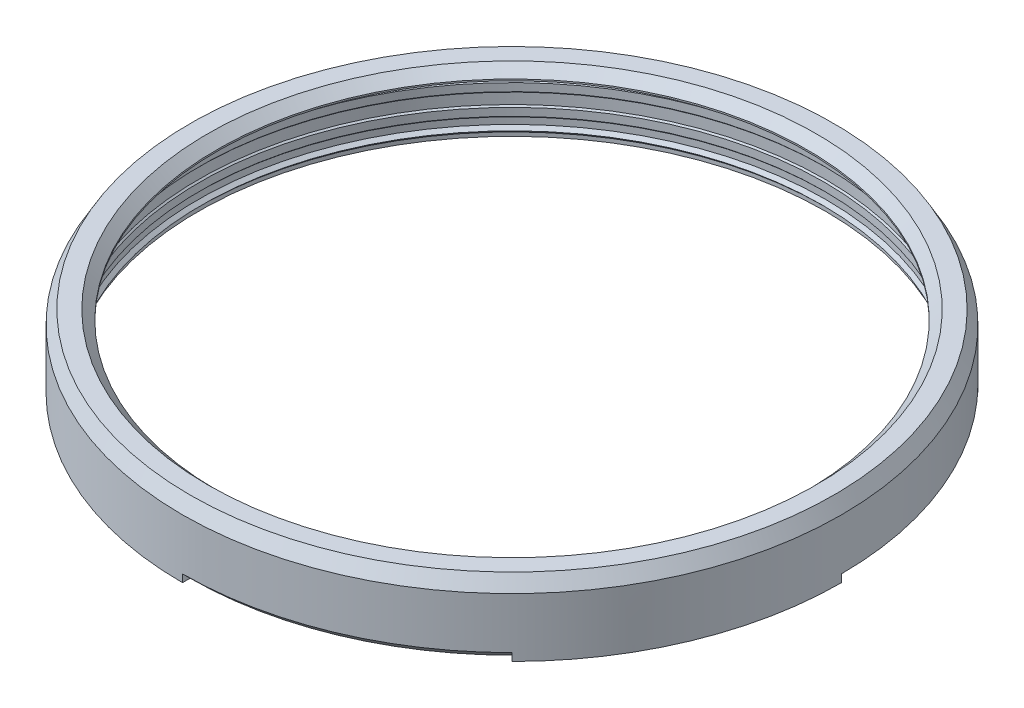
ISO-10303-21;
HEADER;
FILE_DESCRIPTION(('STEP AP214'),'2;1');
FILE_NAME('part.step','',(''),(''),'','','');
FILE_SCHEMA(('AUTOMOTIVE_DESIGN { 1 0 10303 214 1 1 1 1 }'));
ENDSEC;
DATA;
#1=APPLICATION_CONTEXT('core data for automotive mechanical design processes');
#2=APPLICATION_PROTOCOL_DEFINITION('international standard','automotive_design',2000,#1);
#3=PRODUCT_CONTEXT('',#1,'mechanical');
#4=PRODUCT('Part','Part','',(#3));
#5=PRODUCT_RELATED_PRODUCT_CATEGORY('part','',(#4));
#6=PRODUCT_DEFINITION_FORMATION('','',#4);
#7=PRODUCT_DEFINITION_CONTEXT('part definition',#1,'design');
#8=PRODUCT_DEFINITION('design','',#6,#7);
#9=PRODUCT_DEFINITION_SHAPE('','',#8);
#10=(LENGTH_UNIT() NAMED_UNIT(*) SI_UNIT(.MILLI.,.METRE.));
#11=(NAMED_UNIT(*) PLANE_ANGLE_UNIT() SI_UNIT($,.RADIAN.));
#12=(NAMED_UNIT(*) SI_UNIT($,.STERADIAN.) SOLID_ANGLE_UNIT());
#13=UNCERTAINTY_MEASURE_WITH_UNIT(LENGTH_MEASURE(1.E-05),#10,'distance_accuracy_value','');
#14=(GEOMETRIC_REPRESENTATION_CONTEXT(3) GLOBAL_UNCERTAINTY_ASSIGNED_CONTEXT((#13)) GLOBAL_UNIT_ASSIGNED_CONTEXT((#10,
#11,#12)) REPRESENTATION_CONTEXT('',''));
#15=CARTESIAN_POINT('',(0.,0.,0.));
#16=DIRECTION('',(0.,0.,1.));
#17=DIRECTION('',(1.,0.,0.));
#18=AXIS2_PLACEMENT_3D('',#15,#16,#17);
#19=CARTESIAN_POINT('',(0.,-1.39999999999983,0.));
#20=DIRECTION('',(0.,-1.,0.));
#21=DIRECTION('',(0.,0.,-1.));
#22=AXIS2_PLACEMENT_3D('',#19,#20,#21);
#23=TOROIDAL_SURFACE('',#22,39.5300000000001,1.39999999999978);
#24=CARTESIAN_POINT('',(0.,-1.39999999999983,0.));
#25=DIRECTION('',(0.,-1.,0.));
#26=DIRECTION('',(0.,0.,-1.));
#27=AXIS2_PLACEMENT_3D('',#24,#25,#26);
#28=CIRCLE('',#27,40.9299999999999);
#29=CARTESIAN_POINT('',(0.,-1.39999999999983,-40.9299999999999));
#30=VERTEX_POINT('',#29);
#31=EDGE_CURVE('E260',#30,#30,#28,.T.);
#32=ORIENTED_EDGE('',*,*,#31,.T.);
#33=EDGE_LOOP('',(#32));
#34=FACE_BOUND('',#33,.T.);
#35=CARTESIAN_POINT('',(0.,-0.0225022686044408,0.));
#36=DIRECTION('',(0.,-1.,0.));
#37=DIRECTION('',(0.,0.,-1.));
#38=AXIS2_PLACEMENT_3D('',#35,#36,#37);
#39=CIRCLE('',#38,39.78);
#40=CARTESIAN_POINT('',(0.,-0.0225022686044408,-39.78));
#41=VERTEX_POINT('',#40);
#42=EDGE_CURVE('E43',#41,#41,#39,.F.);
#43=ORIENTED_EDGE('',*,*,#42,.T.);
#44=EDGE_LOOP('',(#43));
#45=FACE_BOUND('',#44,.T.);
#46=ADVANCED_FACE('F38',(#34,#45),#23,.F.);
#47=CARTESIAN_POINT('',(0.,0.,0.));
#48=DIRECTION('',(0.,1.,0.));
#49=DIRECTION('',(0.,0.,1.));
#50=AXIS2_PLACEMENT_3D('',#47,#48,#49);
#51=PLANE('',#50);
#52=CARTESIAN_POINT('',(0.,0.,0.));
#53=DIRECTION('',(0.,1.,0.));
#54=DIRECTION('',(0.,0.,1.));
#55=AXIS2_PLACEMENT_3D('',#52,#53,#54);
#56=CIRCLE('',#55,38.5);
#57=CARTESIAN_POINT('',(0.,0.,38.5));
#58=VERTEX_POINT('',#57);
#59=EDGE_CURVE('E218',#58,#58,#56,.T.);
#60=ORIENTED_EDGE('',*,*,#59,.T.);
#61=EDGE_LOOP('',(#60));
#62=FACE_BOUND('',#61,.T.);
#63=CARTESIAN_POINT('',(0.,0.,0.));
#64=DIRECTION('',(0.,-1.,0.));
#65=DIRECTION('',(0.,0.,-1.));
#66=AXIS2_PLACEMENT_3D('',#63,#64,#65);
#67=CIRCLE('',#66,39.32);
#68=CARTESIAN_POINT('',(0.,0.,-39.32));
#69=VERTEX_POINT('',#68);
#70=EDGE_CURVE('E571',#69,#69,#67,.T.);
#71=ORIENTED_EDGE('',*,*,#70,.T.);
#72=EDGE_LOOP('',(#71));
#73=FACE_BOUND('',#72,.T.);
#74=ADVANCED_FACE('F291',(#62,#73),#51,.F.);
#75=CARTESIAN_POINT('',(0.,2.,0.));
#76=DIRECTION('',(0.,-1.,0.));
#77=DIRECTION('',(0.,0.,-1.));
#78=AXIS2_PLACEMENT_3D('',#75,#76,#77);
#79=CYLINDRICAL_SURFACE('',#78,43.);
#80=CARTESIAN_POINT('',(0.,-0.332000000000025,0.));
#81=DIRECTION('',(0.,1.,0.));
#82=DIRECTION('',(0.,0.,1.));
#83=AXIS2_PLACEMENT_3D('',#80,#81,#82);
#84=CIRCLE('',#83,43.);
#85=CARTESIAN_POINT('',(0.,-0.332000000000025,43.));
#86=VERTEX_POINT('',#85);
#87=EDGE_CURVE('E11',#86,#86,#84,.F.);
#88=ORIENTED_EDGE('',*,*,#87,.T.);
#89=EDGE_LOOP('',(#88));
#90=FACE_BOUND('',#89,.T.);
#91=DIRECTION('',(0.,1.,0.));
#92=VECTOR('',#91,1.);
#93=CARTESIAN_POINT('',(-30.4055915910217,-8.,-30.4055915910214));
#94=LINE('',#93,#92);
#95=CARTESIAN_POINT('',(-30.4055915910217,-8.,-30.4055915910214));
#96=VERTEX_POINT('',#95);
#97=CARTESIAN_POINT('',(-30.4055915910217,-7.,-30.4055915910214));
#98=VERTEX_POINT('',#97);
#99=EDGE_CURVE('E148',#96,#98,#94,.T.);
#100=ORIENTED_EDGE('',*,*,#99,.F.);
#101=CARTESIAN_POINT('',(0.,-8.,0.));
#102=DIRECTION('',(0.,-1.,0.));
#103=DIRECTION('',(0.,0.,-1.));
#104=AXIS2_PLACEMENT_3D('',#101,#102,#103);
#105=CIRCLE('',#104,42.9999999999998);
#106=CARTESIAN_POINT('',(-42.9999999999998,-8.,0.));
#107=VERTEX_POINT('',#106);
#108=EDGE_CURVE('E322',#107,#96,#105,.T.);
#109=ORIENTED_EDGE('',*,*,#108,.F.);
#110=DIRECTION('',(0.,1.,0.));
#111=VECTOR('',#110,1.);
#112=CARTESIAN_POINT('',(-43.,-8.,0.));
#113=LINE('',#112,#111);
#114=CARTESIAN_POINT('',(-43.,-7.,0.));
#115=VERTEX_POINT('',#114);
#116=EDGE_CURVE('E63',#107,#115,#113,.T.);
#117=ORIENTED_EDGE('',*,*,#116,.T.);
#118=CARTESIAN_POINT('',(0.,-7.,0.));
#119=DIRECTION('',(0.,-1.,0.));
#120=DIRECTION('',(0.,0.,1.));
#121=AXIS2_PLACEMENT_3D('',#118,#119,#120);
#122=CIRCLE('',#121,43.);
#123=CARTESIAN_POINT('',(-30.4055915910215,-7.,30.4055915910216));
#124=VERTEX_POINT('',#123);
#125=EDGE_CURVE('E166',#124,#115,#122,.T.);
#126=ORIENTED_EDGE('',*,*,#125,.F.);
#127=DIRECTION('',(0.,1.,0.));
#128=VECTOR('',#127,1.);
#129=CARTESIAN_POINT('',(-30.4055915910215,-8.,30.4055915910216));
#130=LINE('',#129,#128);
#131=CARTESIAN_POINT('',(-30.4055915910215,-8.,30.4055915910216));
#132=VERTEX_POINT('',#131);
#133=EDGE_CURVE('E134',#132,#124,#130,.T.);
#134=ORIENTED_EDGE('',*,*,#133,.F.);
#135=CARTESIAN_POINT('',(4.5009785739761E-13,-8.,42.9999999999998));
#136=VERTEX_POINT('',#135);
#137=EDGE_CURVE('E223',#136,#132,#105,.T.);
#138=ORIENTED_EDGE('',*,*,#137,.F.);
#139=DIRECTION('',(0.,1.,0.));
#140=VECTOR('',#139,1.);
#141=CARTESIAN_POINT('',(4.50401092710764E-13,-8.,43.));
#142=LINE('',#141,#140);
#143=CARTESIAN_POINT('',(4.50401092710764E-13,-7.,43.));
#144=VERTEX_POINT('',#143);
#145=EDGE_CURVE('E182',#136,#144,#142,.T.);
#146=ORIENTED_EDGE('',*,*,#145,.T.);
#147=CARTESIAN_POINT('',(0.,-7.,0.));
#148=DIRECTION('',(0.,-1.,0.));
#149=DIRECTION('',(1.,0.,0.));
#150=AXIS2_PLACEMENT_3D('',#147,#148,#149);
#151=CIRCLE('',#150,43.);
#152=CARTESIAN_POINT('',(30.4055915910219,-7.,30.4055915910212));
#153=VERTEX_POINT('',#152);
#154=EDGE_CURVE('E187',#153,#144,#151,.T.);
#155=ORIENTED_EDGE('',*,*,#154,.F.);
#156=DIRECTION('',(0.,1.,0.));
#157=VECTOR('',#156,1.);
#158=CARTESIAN_POINT('',(30.4055915910219,-8.,30.4055915910212));
#159=LINE('',#158,#157);
#160=CARTESIAN_POINT('',(30.4055915910219,-8.,30.4055915910212));
#161=VERTEX_POINT('',#160);
#162=EDGE_CURVE('E160',#161,#153,#159,.T.);
#163=ORIENTED_EDGE('',*,*,#162,.F.);
#164=CARTESIAN_POINT('',(42.9999999999998,-8.,0.));
#165=VERTEX_POINT('',#164);
#166=EDGE_CURVE('E219',#165,#161,#105,.T.);
#167=ORIENTED_EDGE('',*,*,#166,.F.);
#168=DIRECTION('',(0.,1.,0.));
#169=VECTOR('',#168,1.);
#170=CARTESIAN_POINT('',(43.,-8.,0.));
#171=LINE('',#170,#169);
#172=CARTESIAN_POINT('',(43.,-7.,0.));
#173=VERTEX_POINT('',#172);
#174=EDGE_CURVE('E199',#165,#173,#171,.T.);
#175=ORIENTED_EDGE('',*,*,#174,.T.);
#176=CARTESIAN_POINT('',(0.,-7.,0.));
#177=DIRECTION('',(0.,-1.,0.));
#178=DIRECTION('',(0.,0.,-1.));
#179=AXIS2_PLACEMENT_3D('',#176,#177,#178);
#180=CIRCLE('',#179,43.);
#181=CARTESIAN_POINT('',(30.4055915910215,-7.,-30.4055915910216));
#182=VERTEX_POINT('',#181);
#183=EDGE_CURVE('E216',#182,#173,#180,.T.);
#184=ORIENTED_EDGE('',*,*,#183,.F.);
#185=DIRECTION('',(0.,1.,0.));
#186=VECTOR('',#185,1.);
#187=CARTESIAN_POINT('',(30.4055915910215,-8.,-30.4055915910216));
#188=LINE('',#187,#186);
#189=CARTESIAN_POINT('',(30.4055915910215,-8.,-30.4055915910216));
#190=VERTEX_POINT('',#189);
#191=EDGE_CURVE('E208',#190,#182,#188,.T.);
#192=ORIENTED_EDGE('',*,*,#191,.F.);
#193=CARTESIAN_POINT('',(-1.50234776007971E-13,-8.,-42.9999999999998));
#194=VERTEX_POINT('',#193);
#195=EDGE_CURVE('E224',#194,#190,#105,.T.);
#196=ORIENTED_EDGE('',*,*,#195,.F.);
#197=DIRECTION('',(0.,1.,0.));
#198=VECTOR('',#197,1.);
#199=CARTESIAN_POINT('',(-1.50133697570255E-13,-8.,-43.));
#200=LINE('',#199,#198);
#201=CARTESIAN_POINT('',(-1.50133697570255E-13,-7.,-43.));
#202=VERTEX_POINT('',#201);
#203=EDGE_CURVE('E55',#194,#202,#200,.T.);
#204=ORIENTED_EDGE('',*,*,#203,.T.);
#205=CARTESIAN_POINT('',(0.,-7.,0.));
#206=DIRECTION('',(0.,-1.,0.));
#207=DIRECTION('',(-1.,0.,0.));
#208=AXIS2_PLACEMENT_3D('',#205,#206,#207);
#209=CIRCLE('',#208,43.);
#210=EDGE_CURVE('E142',#98,#202,#209,.T.);
#211=ORIENTED_EDGE('',*,*,#210,.F.);
#212=EDGE_LOOP('',(#100,#109,#117,#126,#134,#138,#146,#155,#163,#167,#175,#184,#192,#196,#204,#211));
#213=FACE_BOUND('',#212,.T.);
#214=ADVANCED_FACE('F299',(#90,#213),#79,.T.);
#215=CARTESIAN_POINT('',(20.5178266911639,-8.,37.7891358444639));
#216=DIRECTION('',(0.,-1.,0.));
#217=DIRECTION('',(0.,0.,-1.));
#218=AXIS2_PLACEMENT_3D('',#215,#216,#217);
#219=PLANE('',#218);
#220=CARTESIAN_POINT('',(0.,-8.00000000000001,0.));
#221=DIRECTION('',(0.,-1.,0.));
#222=DIRECTION('',(0.,0.,-1.));
#223=AXIS2_PLACEMENT_3D('',#220,#221,#222);
#224=CIRCLE('',#223,40.9299999999999);
#225=CARTESIAN_POINT('',(0.,-8.00000000000001,-40.9299999999999));
#226=VERTEX_POINT('',#225);
#227=EDGE_CURVE('E222',#226,#226,#224,.T.);
#228=ORIENTED_EDGE('',*,*,#227,.F.);
#229=EDGE_LOOP('',(#228));
#230=FACE_BOUND('',#229,.T.);
#231=ORIENTED_EDGE('',*,*,#108,.T.);
#232=DIRECTION('',(-0.707106781186551,0.,-0.707106781186544));
#233=VECTOR('',#232,1.);
#234=CARTESIAN_POINT('',(-29.6984848098352,-8.00000000000001,-29.6984848098348));
#235=LINE('',#234,#233);
#236=CARTESIAN_POINT('',(-29.6984848098352,-8.00000000000001,-29.6984848098348));
#237=VERTEX_POINT('',#236);
#238=EDGE_CURVE('E146',#237,#96,#235,.T.);
#239=ORIENTED_EDGE('',*,*,#238,.F.);
#240=CARTESIAN_POINT('',(0.,-8.00000000000001,0.));
#241=DIRECTION('',(0.,-1.,0.));
#242=DIRECTION('',(-1.,0.,0.));
#243=AXIS2_PLACEMENT_3D('',#240,#241,#242);
#244=CIRCLE('',#243,42.);
#245=CARTESIAN_POINT('',(-1.46642216231412E-13,-8.00000000000001,-42.));
#246=VERTEX_POINT('',#245);
#247=EDGE_CURVE('E139',#237,#246,#244,.T.);
#248=ORIENTED_EDGE('',*,*,#247,.T.);
#249=DIRECTION('',(0.,0.,-1.));
#250=VECTOR('',#249,1.);
#251=CARTESIAN_POINT('',(-1.46642216231412E-13,-8.00000000000001,-42.));
#252=LINE('',#251,#250);
#253=EDGE_CURVE('E126',#246,#194,#252,.T.);
#254=ORIENTED_EDGE('',*,*,#253,.T.);
#255=ORIENTED_EDGE('',*,*,#195,.T.);
#256=DIRECTION('',(0.707106781186546,0.,-0.707106781186549));
#257=VECTOR('',#256,1.);
#258=CARTESIAN_POINT('',(29.6984848098349,-8.00000000000001,-29.698484809835));
#259=LINE('',#258,#257);
#260=CARTESIAN_POINT('',(29.6984848098349,-8.00000000000001,-29.698484809835));
#261=VERTEX_POINT('',#260);
#262=EDGE_CURVE('E205',#261,#190,#259,.T.);
#263=ORIENTED_EDGE('',*,*,#262,.F.);
#264=CARTESIAN_POINT('',(0.,-8.00000000000001,0.));
#265=DIRECTION('',(0.,-1.,0.));
#266=DIRECTION('',(0.,0.,-1.));
#267=AXIS2_PLACEMENT_3D('',#264,#265,#266);
#268=CIRCLE('',#267,42.);
#269=CARTESIAN_POINT('',(42.,-8.00000000000001,0.));
#270=VERTEX_POINT('',#269);
#271=EDGE_CURVE('E213',#261,#270,#268,.T.);
#272=ORIENTED_EDGE('',*,*,#271,.T.);
#273=DIRECTION('',(1.,0.,0.));
#274=VECTOR('',#273,1.);
#275=CARTESIAN_POINT('',(42.,-8.00000000000001,0.));
#276=LINE('',#275,#274);
#277=EDGE_CURVE('E156',#270,#165,#276,.T.);
#278=ORIENTED_EDGE('',*,*,#277,.T.);
#279=ORIENTED_EDGE('',*,*,#166,.T.);
#280=DIRECTION('',(0.707106781186556,0.,0.707106781186539));
#281=VECTOR('',#280,1.);
#282=CARTESIAN_POINT('',(29.6984848098354,-8.00000000000001,29.6984848098346));
#283=LINE('',#282,#281);
#284=CARTESIAN_POINT('',(29.6984848098354,-8.00000000000001,29.6984848098346));
#285=VERTEX_POINT('',#284);
#286=EDGE_CURVE('E193',#285,#161,#283,.T.);
#287=ORIENTED_EDGE('',*,*,#286,.F.);
#288=CARTESIAN_POINT('',(0.,-8.00000000000001,0.));
#289=DIRECTION('',(0.,-1.,0.));
#290=DIRECTION('',(1.,0.,0.));
#291=AXIS2_PLACEMENT_3D('',#288,#289,#290);
#292=CIRCLE('',#291,42.);
#293=CARTESIAN_POINT('',(4.39926648694235E-13,-8.00000000000001,42.));
#294=VERTEX_POINT('',#293);
#295=EDGE_CURVE('E190',#285,#294,#292,.T.);
#296=ORIENTED_EDGE('',*,*,#295,.T.);
#297=DIRECTION('',(0.,0.,1.));
#298=VECTOR('',#297,1.);
#299=CARTESIAN_POINT('',(4.39926648694235E-13,-8.00000000000001,42.));
#300=LINE('',#299,#298);
#301=EDGE_CURVE('E176',#294,#136,#300,.T.);
#302=ORIENTED_EDGE('',*,*,#301,.T.);
#303=ORIENTED_EDGE('',*,*,#137,.T.);
#304=DIRECTION('',(-0.707106781186546,0.,0.707106781186549));
#305=VECTOR('',#304,1.);
#306=CARTESIAN_POINT('',(-29.6984848098349,-8.00000000000001,29.698484809835));
#307=LINE('',#306,#305);
#308=CARTESIAN_POINT('',(-29.6984848098349,-8.00000000000001,29.698484809835));
#309=VERTEX_POINT('',#308);
#310=EDGE_CURVE('E172',#309,#132,#307,.T.);
#311=ORIENTED_EDGE('',*,*,#310,.F.);
#312=CARTESIAN_POINT('',(0.,-8.00000000000001,0.));
#313=DIRECTION('',(0.,-1.,0.));
#314=DIRECTION('',(0.,0.,1.));
#315=AXIS2_PLACEMENT_3D('',#312,#313,#314);
#316=CIRCLE('',#315,42.);
#317=CARTESIAN_POINT('',(-42.,-8.00000000000001,0.));
#318=VERTEX_POINT('',#317);
#319=EDGE_CURVE('E169',#309,#318,#316,.T.);
#320=ORIENTED_EDGE('',*,*,#319,.T.);
#321=DIRECTION('',(-1.,0.,0.));
#322=VECTOR('',#321,1.);
#323=CARTESIAN_POINT('',(-42.,-8.00000000000001,0.));
#324=LINE('',#323,#322);
#325=EDGE_CURVE('E157',#318,#107,#324,.T.);
#326=ORIENTED_EDGE('',*,*,#325,.T.);
#327=EDGE_LOOP('',(#231,#239,#248,#254,#255,#263,#272,#278,#279,#287,#296,#302,#303,#311,#320,#326));
#328=FACE_BOUND('',#327,.T.);
#329=ADVANCED_FACE('F145',(#230,#328),#219,.T.);
#330=CARTESIAN_POINT('',(0.,-8.00000000000001,0.));
#331=DIRECTION('',(0.,1.,0.));
#332=DIRECTION('',(0.,0.,1.));
#333=AXIS2_PLACEMENT_3D('',#330,#331,#332);
#334=CYLINDRICAL_SURFACE('',#333,38.5);
#335=CARTESIAN_POINT('',(0.,0.200000000000001,0.));
#336=DIRECTION('',(0.,1.,0.));
#337=DIRECTION('',(0.,0.,1.));
#338=AXIS2_PLACEMENT_3D('',#335,#336,#337);
#339=CIRCLE('',#338,38.5);
#340=CARTESIAN_POINT('',(0.,0.200000000000001,38.5));
#341=VERTEX_POINT('',#340);
#342=EDGE_CURVE('E268',#341,#341,#339,.T.);
#343=ORIENTED_EDGE('',*,*,#342,.T.);
#344=EDGE_LOOP('',(#343));
#345=FACE_BOUND('',#344,.T.);
#346=ORIENTED_EDGE('',*,*,#59,.F.);
#347=EDGE_LOOP('',(#346));
#348=FACE_BOUND('',#347,.T.);
#349=ADVANCED_FACE('F316',(#345,#348),#334,.F.);
#350=CARTESIAN_POINT('',(0.,0.,0.));
#351=DIRECTION('',(0.,-1.,0.));
#352=DIRECTION('',(0.,0.,-1.));
#353=AXIS2_PLACEMENT_3D('',#350,#351,#352);
#354=CYLINDRICAL_SURFACE('',#353,40.9299999999999);
#355=CARTESIAN_POINT('',(0.,-1.59999999999961,0.));
#356=DIRECTION('',(0.,-1.,0.));
#357=DIRECTION('',(0.,0.,-1.));
#358=AXIS2_PLACEMENT_3D('',#355,#356,#357);
#359=CIRCLE('',#358,40.9299999999999);
#360=CARTESIAN_POINT('',(0.,-1.59999999999961,-40.9299999999999));
#361=VERTEX_POINT('',#360);
#362=EDGE_CURVE('E257',#361,#361,#359,.T.);
#363=ORIENTED_EDGE('',*,*,#362,.T.);
#364=EDGE_LOOP('',(#363));
#365=FACE_BOUND('',#364,.T.);
#366=ORIENTED_EDGE('',*,*,#31,.F.);
#367=EDGE_LOOP('',(#366));
#368=FACE_BOUND('',#367,.T.);
#369=ADVANCED_FACE('F304',(#365,#368),#354,.F.);
#370=CARTESIAN_POINT('',(0.,-1.59999999999961,0.));
#371=DIRECTION('',(0.,1.,0.));
#372=DIRECTION('',(0.,0.,1.));
#373=AXIS2_PLACEMENT_3D('',#370,#371,#372);
#374=CONICAL_SURFACE('',#373,40.9299999999999,0.785398163397453);
#375=CARTESIAN_POINT('',(0.,-1.78999999999966,0.));
#376=DIRECTION('',(0.,-1.,0.));
#377=DIRECTION('',(0.,0.,-1.));
#378=AXIS2_PLACEMENT_3D('',#375,#376,#377);
#379=CIRCLE('',#378,40.7399999999998);
#380=CARTESIAN_POINT('',(0.,-1.78999999999966,-40.7399999999998));
#381=VERTEX_POINT('',#380);
#382=EDGE_CURVE('E254',#381,#381,#379,.T.);
#383=ORIENTED_EDGE('',*,*,#382,.T.);
#384=EDGE_LOOP('',(#383));
#385=FACE_BOUND('',#384,.T.);
#386=ORIENTED_EDGE('',*,*,#362,.F.);
#387=EDGE_LOOP('',(#386));
#388=FACE_BOUND('',#387,.T.);
#389=ADVANCED_FACE('F420',(#385,#388),#374,.F.);
#390=CARTESIAN_POINT('',(0.,0.,0.));
#391=DIRECTION('',(0.,-1.,0.));
#392=DIRECTION('',(0.,0.,-1.));
#393=AXIS2_PLACEMENT_3D('',#390,#391,#392);
#394=CYLINDRICAL_SURFACE('',#393,40.7399999999998);
#395=CARTESIAN_POINT('',(0.,-2.80999999999967,0.));
#396=DIRECTION('',(0.,-1.,0.));
#397=DIRECTION('',(0.,0.,-1.));
#398=AXIS2_PLACEMENT_3D('',#395,#396,#397);
#399=CIRCLE('',#398,40.7399999999998);
#400=CARTESIAN_POINT('',(0.,-2.80999999999967,-40.7399999999998));
#401=VERTEX_POINT('',#400);
#402=EDGE_CURVE('E251',#401,#401,#399,.T.);
#403=ORIENTED_EDGE('',*,*,#402,.T.);
#404=EDGE_LOOP('',(#403));
#405=FACE_BOUND('',#404,.T.);
#406=ORIENTED_EDGE('',*,*,#382,.F.);
#407=EDGE_LOOP('',(#406));
#408=FACE_BOUND('',#407,.T.);
#409=ADVANCED_FACE('F417',(#405,#408),#394,.F.);
#410=CARTESIAN_POINT('',(0.,-2.80999999999967,0.));
#411=DIRECTION('',(0.,-1.,0.));
#412=DIRECTION('',(0.,0.,-1.));
#413=AXIS2_PLACEMENT_3D('',#410,#411,#412);
#414=CONICAL_SURFACE('',#413,40.7399999999998,0.785398163397501);
#415=CARTESIAN_POINT('',(0.,-2.99999999999968,0.));
#416=DIRECTION('',(0.,-1.,0.));
#417=DIRECTION('',(0.,0.,-1.));
#418=AXIS2_PLACEMENT_3D('',#415,#416,#417);
#419=CIRCLE('',#418,40.9299999999999);
#420=CARTESIAN_POINT('',(0.,-2.99999999999968,-40.9299999999999));
#421=VERTEX_POINT('',#420);
#422=EDGE_CURVE('E248',#421,#421,#419,.T.);
#423=ORIENTED_EDGE('',*,*,#422,.T.);
#424=EDGE_LOOP('',(#423));
#425=FACE_BOUND('',#424,.T.);
#426=ORIENTED_EDGE('',*,*,#402,.F.);
#427=EDGE_LOOP('',(#426));
#428=FACE_BOUND('',#427,.T.);
#429=ADVANCED_FACE('F413',(#425,#428),#414,.F.);
#430=CARTESIAN_POINT('',(0.,0.,0.));
#431=DIRECTION('',(0.,-1.,0.));
#432=DIRECTION('',(0.,0.,-1.));
#433=AXIS2_PLACEMENT_3D('',#430,#431,#432);
#434=CYLINDRICAL_SURFACE('',#433,40.9299999999999);
#435=CARTESIAN_POINT('',(0.,-4.39999999999967,0.));
#436=DIRECTION('',(0.,-1.,0.));
#437=DIRECTION('',(0.,0.,-1.));
#438=AXIS2_PLACEMENT_3D('',#435,#436,#437);
#439=CIRCLE('',#438,40.9299999999999);
#440=CARTESIAN_POINT('',(0.,-4.39999999999967,-40.9299999999999));
#441=VERTEX_POINT('',#440);
#442=EDGE_CURVE('E245',#441,#441,#439,.T.);
#443=ORIENTED_EDGE('',*,*,#442,.T.);
#444=EDGE_LOOP('',(#443));
#445=FACE_BOUND('',#444,.T.);
#446=ORIENTED_EDGE('',*,*,#422,.F.);
#447=EDGE_LOOP('',(#446));
#448=FACE_BOUND('',#447,.T.);
#449=ADVANCED_FACE('F409',(#445,#448),#434,.F.);
#450=CARTESIAN_POINT('',(0.,-4.39999999999967,0.));
#451=DIRECTION('',(0.,1.,0.));
#452=DIRECTION('',(0.,0.,1.));
#453=AXIS2_PLACEMENT_3D('',#450,#451,#452);
#454=CONICAL_SURFACE('',#453,40.9299999999999,0.785398163397384);
#455=CARTESIAN_POINT('',(0.,-4.58999999999972,0.));
#456=DIRECTION('',(0.,-1.,0.));
#457=DIRECTION('',(0.,0.,-1.));
#458=AXIS2_PLACEMENT_3D('',#455,#456,#457);
#459=CIRCLE('',#458,40.7399999999998);
#460=CARTESIAN_POINT('',(0.,-4.58999999999972,-40.7399999999998));
#461=VERTEX_POINT('',#460);
#462=EDGE_CURVE('E242',#461,#461,#459,.T.);
#463=ORIENTED_EDGE('',*,*,#462,.T.);
#464=EDGE_LOOP('',(#463));
#465=FACE_BOUND('',#464,.T.);
#466=ORIENTED_EDGE('',*,*,#442,.F.);
#467=EDGE_LOOP('',(#466));
#468=FACE_BOUND('',#467,.T.);
#469=ADVANCED_FACE('F405',(#465,#468),#454,.F.);
#470=CARTESIAN_POINT('',(0.,0.,0.));
#471=DIRECTION('',(0.,-1.,0.));
#472=DIRECTION('',(0.,0.,-1.));
#473=AXIS2_PLACEMENT_3D('',#470,#471,#472);
#474=CYLINDRICAL_SURFACE('',#473,40.7399999999998);
#475=CARTESIAN_POINT('',(0.,-5.60999999999969,0.));
#476=DIRECTION('',(0.,-1.,0.));
#477=DIRECTION('',(0.,0.,-1.));
#478=AXIS2_PLACEMENT_3D('',#475,#476,#477);
#479=CIRCLE('',#478,40.7399999999998);
#480=CARTESIAN_POINT('',(0.,-5.60999999999969,-40.7399999999998));
#481=VERTEX_POINT('',#480);
#482=EDGE_CURVE('E239',#481,#481,#479,.T.);
#483=ORIENTED_EDGE('',*,*,#482,.T.);
#484=EDGE_LOOP('',(#483));
#485=FACE_BOUND('',#484,.T.);
#486=ORIENTED_EDGE('',*,*,#462,.F.);
#487=EDGE_LOOP('',(#486));
#488=FACE_BOUND('',#487,.T.);
#489=ADVANCED_FACE('F401',(#485,#488),#474,.F.);
#490=CARTESIAN_POINT('',(0.,-5.60999999999969,0.));
#491=DIRECTION('',(0.,-1.,0.));
#492=DIRECTION('',(0.,0.,-1.));
#493=AXIS2_PLACEMENT_3D('',#490,#491,#492);
#494=CONICAL_SURFACE('',#493,40.7399999999998,0.785398163397505);
#495=CARTESIAN_POINT('',(0.,-5.7999999999997,0.));
#496=DIRECTION('',(0.,-1.,0.));
#497=DIRECTION('',(0.,0.,-1.));
#498=AXIS2_PLACEMENT_3D('',#495,#496,#497);
#499=CIRCLE('',#498,40.9299999999999);
#500=CARTESIAN_POINT('',(0.,-5.7999999999997,-40.9299999999999));
#501=VERTEX_POINT('',#500);
#502=EDGE_CURVE('E236',#501,#501,#499,.T.);
#503=ORIENTED_EDGE('',*,*,#502,.T.);
#504=EDGE_LOOP('',(#503));
#505=FACE_BOUND('',#504,.T.);
#506=ORIENTED_EDGE('',*,*,#482,.F.);
#507=EDGE_LOOP('',(#506));
#508=FACE_BOUND('',#507,.T.);
#509=ADVANCED_FACE('F397',(#505,#508),#494,.F.);
#510=CARTESIAN_POINT('',(0.,0.,0.));
#511=DIRECTION('',(0.,-1.,0.));
#512=DIRECTION('',(0.,0.,-1.));
#513=AXIS2_PLACEMENT_3D('',#510,#511,#512);
#514=CYLINDRICAL_SURFACE('',#513,40.9299999999999);
#515=CARTESIAN_POINT('',(0.,-6.64999999999969,0.));
#516=DIRECTION('',(0.,-1.,0.));
#517=DIRECTION('',(0.,0.,-1.));
#518=AXIS2_PLACEMENT_3D('',#515,#516,#517);
#519=CIRCLE('',#518,40.9299999999999);
#520=CARTESIAN_POINT('',(0.,-6.64999999999969,-40.9299999999999));
#521=VERTEX_POINT('',#520);
#522=EDGE_CURVE('E233',#521,#521,#519,.T.);
#523=ORIENTED_EDGE('',*,*,#522,.T.);
#524=EDGE_LOOP('',(#523));
#525=FACE_BOUND('',#524,.T.);
#526=ORIENTED_EDGE('',*,*,#502,.F.);
#527=EDGE_LOOP('',(#526));
#528=FACE_BOUND('',#527,.T.);
#529=ADVANCED_FACE('F393',(#525,#528),#514,.F.);
#530=CARTESIAN_POINT('',(0.,-6.64999999999969,0.));
#531=DIRECTION('',(0.,1.,0.));
#532=DIRECTION('',(0.,0.,1.));
#533=AXIS2_PLACEMENT_3D('',#530,#531,#532);
#534=CONICAL_SURFACE('',#533,40.9299999999999,0.785398163397382);
#535=CARTESIAN_POINT('',(0.,-7.07499999999989,0.));
#536=DIRECTION('',(0.,-1.,0.));
#537=DIRECTION('',(0.,0.,-1.));
#538=AXIS2_PLACEMENT_3D('',#535,#536,#537);
#539=CIRCLE('',#538,40.5049999999997);
#540=CARTESIAN_POINT('',(0.,-7.07499999999989,-40.5049999999997));
#541=VERTEX_POINT('',#540);
#542=EDGE_CURVE('E230',#541,#541,#539,.T.);
#543=ORIENTED_EDGE('',*,*,#542,.T.);
#544=EDGE_LOOP('',(#543));
#545=FACE_BOUND('',#544,.T.);
#546=ORIENTED_EDGE('',*,*,#522,.F.);
#547=EDGE_LOOP('',(#546));
#548=FACE_BOUND('',#547,.T.);
#549=ADVANCED_FACE('F389',(#545,#548),#534,.F.);
#550=CARTESIAN_POINT('',(0.,-7.07499999999989,0.));
#551=DIRECTION('',(0.,-1.,0.));
#552=DIRECTION('',(0.,0.,-1.));
#553=AXIS2_PLACEMENT_3D('',#550,#551,#552);
#554=CONICAL_SURFACE('',#553,40.5049999999997,0.785398163397509);
#555=CARTESIAN_POINT('',(0.,-7.49999999999999,0.));
#556=DIRECTION('',(0.,-1.,0.));
#557=DIRECTION('',(0.,0.,-1.));
#558=AXIS2_PLACEMENT_3D('',#555,#556,#557);
#559=CIRCLE('',#558,40.9299999999999);
#560=CARTESIAN_POINT('',(0.,-7.49999999999999,-40.9299999999999));
#561=VERTEX_POINT('',#560);
#562=EDGE_CURVE('E227',#561,#561,#559,.T.);
#563=ORIENTED_EDGE('',*,*,#562,.T.);
#564=EDGE_LOOP('',(#563));
#565=FACE_BOUND('',#564,.T.);
#566=ORIENTED_EDGE('',*,*,#542,.F.);
#567=EDGE_LOOP('',(#566));
#568=FACE_BOUND('',#567,.T.);
#569=ADVANCED_FACE('F385',(#565,#568),#554,.F.);
#570=CARTESIAN_POINT('',(0.,0.,0.));
#571=DIRECTION('',(0.,-1.,0.));
#572=DIRECTION('',(0.,0.,-1.));
#573=AXIS2_PLACEMENT_3D('',#570,#571,#572);
#574=CYLINDRICAL_SURFACE('',#573,40.9299999999999);
#575=ORIENTED_EDGE('',*,*,#227,.T.);
#576=EDGE_LOOP('',(#575));
#577=FACE_BOUND('',#576,.T.);
#578=ORIENTED_EDGE('',*,*,#562,.F.);
#579=EDGE_LOOP('',(#578));
#580=FACE_BOUND('',#579,.T.);
#581=ADVANCED_FACE('F379',(#577,#580),#574,.F.);
#582=CARTESIAN_POINT('',(0.,1.4,0.));
#583=DIRECTION('',(0.,1.,0.));
#584=DIRECTION('',(0.,0.,1.));
#585=AXIS2_PLACEMENT_3D('',#582,#583,#584);
#586=PLANE('',#585);
#587=CARTESIAN_POINT('',(0.,1.4,0.));
#588=DIRECTION('',(0.,1.,0.));
#589=DIRECTION('',(0.,0.,1.));
#590=AXIS2_PLACEMENT_3D('',#587,#588,#589);
#591=CIRCLE('',#590,42.0000293337636);
#592=CARTESIAN_POINT('',(0.,1.4,42.0000293337636));
#593=VERTEX_POINT('',#592);
#594=EDGE_CURVE('E48',#593,#593,#591,.T.);
#595=ORIENTED_EDGE('',*,*,#594,.T.);
#596=EDGE_LOOP('',(#595));
#597=FACE_BOUND('',#596,.T.);
#598=CARTESIAN_POINT('',(0.,1.4,0.));
#599=DIRECTION('',(0.,1.,0.));
#600=DIRECTION('',(0.,0.,1.));
#601=AXIS2_PLACEMENT_3D('',#598,#599,#600);
#602=CIRCLE('',#601,39.7);
#603=CARTESIAN_POINT('',(0.,1.4,39.7));
#604=VERTEX_POINT('',#603);
#605=EDGE_CURVE('E263',#604,#604,#602,.F.);
#606=ORIENTED_EDGE('',*,*,#605,.T.);
#607=EDGE_LOOP('',(#606));
#608=FACE_BOUND('',#607,.T.);
#609=ADVANCED_FACE('F274',(#597,#608),#586,.T.);
#610=CARTESIAN_POINT('',(0.,1.4,0.));
#611=DIRECTION('',(0.,1.,0.));
#612=DIRECTION('',(0.,0.,1.));
#613=AXIS2_PLACEMENT_3D('',#610,#611,#612);
#614=CONICAL_SURFACE('',#613,39.7,0.785398163397445);
#615=ORIENTED_EDGE('',*,*,#342,.F.);
#616=EDGE_LOOP('',(#615));
#617=FACE_BOUND('',#616,.T.);
#618=ORIENTED_EDGE('',*,*,#605,.F.);
#619=EDGE_LOOP('',(#618));
#620=FACE_BOUND('',#619,.T.);
#621=ADVANCED_FACE('F279',(#617,#620),#614,.F.);
#622=CARTESIAN_POINT('',(0.,1.4,0.));
#623=DIRECTION('',(0.,-1.,0.));
#624=DIRECTION('',(0.,0.,-1.));
#625=AXIS2_PLACEMENT_3D('',#622,#623,#624);
#626=CONICAL_SURFACE('',#625,42.0000293337636,0.523598775598295);
#627=ORIENTED_EDGE('',*,*,#87,.F.);
#628=EDGE_LOOP('',(#627));
#629=FACE_BOUND('',#628,.T.);
#630=ORIENTED_EDGE('',*,*,#594,.F.);
#631=EDGE_LOOP('',(#630));
#632=FACE_BOUND('',#631,.T.);
#633=ADVANCED_FACE('F41',(#629,#632),#626,.T.);
#634=CARTESIAN_POINT('',(0.,-7.,0.));
#635=DIRECTION('',(0.,1.,0.));
#636=DIRECTION('',(0.,0.,1.));
#637=AXIS2_PLACEMENT_3D('',#634,#635,#636);
#638=CONICAL_SURFACE('',#637,43.,0.785398163397445);
#639=DIRECTION('',(-0.499999999999999,-0.707106781186548,0.500000000000001));
#640=VECTOR('',#639,1.);
#641=CARTESIAN_POINT('',(30.4055915910215,-7.,-30.4055915910216));
#642=LINE('',#641,#640);
#643=EDGE_CURVE('E210',#182,#261,#642,.T.);
#644=ORIENTED_EDGE('',*,*,#643,.F.);
#645=ORIENTED_EDGE('',*,*,#183,.T.);
#646=DIRECTION('',(-0.707106781186547,-0.707106781186548,0.));
#647=VECTOR('',#646,1.);
#648=CARTESIAN_POINT('',(43.,-7.,0.));
#649=LINE('',#648,#647);
#650=EDGE_CURVE('E202',#173,#270,#649,.T.);
#651=ORIENTED_EDGE('',*,*,#650,.T.);
#652=ORIENTED_EDGE('',*,*,#271,.F.);
#653=EDGE_LOOP('',(#644,#645,#651,#652));
#654=FACE_BOUND('',#653,.T.);
#655=ADVANCED_FACE('F278',(#654),#638,.T.);
#656=CARTESIAN_POINT('',(0.,0.,0.));
#657=DIRECTION('',(0.707106781186549,0.,0.707106781186546));
#658=DIRECTION('',(0.707106781186546,0.,-0.707106781186549));
#659=AXIS2_PLACEMENT_3D('',#656,#657,#658);
#660=PLANE('',#659);
#661=ORIENTED_EDGE('',*,*,#262,.T.);
#662=ORIENTED_EDGE('',*,*,#191,.T.);
#663=ORIENTED_EDGE('',*,*,#643,.T.);
#664=EDGE_LOOP('',(#661,#662,#663));
#665=FACE_BOUND('',#664,.T.);
#666=ADVANCED_FACE('F285',(#665),#660,.T.);
#667=CARTESIAN_POINT('',(0.,0.,0.));
#668=DIRECTION('',(0.,0.,1.));
#669=DIRECTION('',(1.,0.,0.));
#670=AXIS2_PLACEMENT_3D('',#667,#668,#669);
#671=PLANE('',#670);
#672=ORIENTED_EDGE('',*,*,#277,.F.);
#673=ORIENTED_EDGE('',*,*,#650,.F.);
#674=ORIENTED_EDGE('',*,*,#174,.F.);
#675=EDGE_LOOP('',(#672,#673,#674));
#676=FACE_BOUND('',#675,.T.);
#677=ADVANCED_FACE('F333',(#676),#671,.F.);
#678=CARTESIAN_POINT('',(0.,0.,0.));
#679=DIRECTION('',(-0.707106781186539,0.,0.707106781186556));
#680=DIRECTION('',(0.707106781186556,0.,0.707106781186539));
#681=AXIS2_PLACEMENT_3D('',#678,#679,#680);
#682=PLANE('',#681);
#683=ORIENTED_EDGE('',*,*,#286,.T.);
#684=ORIENTED_EDGE('',*,*,#162,.T.);
#685=DIRECTION('',(-0.500000000000006,-0.707106781186548,-0.499999999999994));
#686=VECTOR('',#685,1.);
#687=CARTESIAN_POINT('',(30.4055915910219,-7.,30.4055915910212));
#688=LINE('',#687,#686);
#689=EDGE_CURVE('E185',#153,#285,#688,.T.);
#690=ORIENTED_EDGE('',*,*,#689,.T.);
#691=EDGE_LOOP('',(#683,#684,#690));
#692=FACE_BOUND('',#691,.T.);
#693=ADVANCED_FACE('F338',(#692),#682,.T.);
#694=CARTESIAN_POINT('',(0.,-7.,0.));
#695=DIRECTION('',(0.,1.,0.));
#696=DIRECTION('',(-1.,0.,0.));
#697=AXIS2_PLACEMENT_3D('',#694,#695,#696);
#698=CONICAL_SURFACE('',#697,43.,0.785398163397445);
#699=ORIENTED_EDGE('',*,*,#689,.F.);
#700=ORIENTED_EDGE('',*,*,#154,.T.);
#701=DIRECTION('',(0.,-0.707106781186548,-0.707106781186547));
#702=VECTOR('',#701,1.);
#703=CARTESIAN_POINT('',(4.50401092710764E-13,-7.,43.));
#704=LINE('',#703,#702);
#705=EDGE_CURVE('E179',#144,#294,#704,.T.);
#706=ORIENTED_EDGE('',*,*,#705,.T.);
#707=ORIENTED_EDGE('',*,*,#295,.F.);
#708=EDGE_LOOP('',(#699,#700,#706,#707));
#709=FACE_BOUND('',#708,.T.);
#710=ADVANCED_FACE('F342',(#709),#698,.T.);
#711=CARTESIAN_POINT('',(0.,0.,0.));
#712=DIRECTION('',(-1.,0.,0.));
#713=DIRECTION('',(0.,0.,1.));
#714=AXIS2_PLACEMENT_3D('',#711,#712,#713);
#715=PLANE('',#714);
#716=ORIENTED_EDGE('',*,*,#301,.F.);
#717=ORIENTED_EDGE('',*,*,#705,.F.);
#718=ORIENTED_EDGE('',*,*,#145,.F.);
#719=EDGE_LOOP('',(#716,#717,#718));
#720=FACE_BOUND('',#719,.T.);
#721=ADVANCED_FACE('F344',(#720),#715,.F.);
#722=CARTESIAN_POINT('',(0.,0.,0.));
#723=DIRECTION('',(-0.707106781186549,0.,-0.707106781186546));
#724=DIRECTION('',(-0.707106781186546,0.,0.707106781186549));
#725=AXIS2_PLACEMENT_3D('',#722,#723,#724);
#726=PLANE('',#725);
#727=ORIENTED_EDGE('',*,*,#310,.T.);
#728=ORIENTED_EDGE('',*,*,#133,.T.);
#729=DIRECTION('',(0.499999999999999,-0.707106781186548,-0.500000000000001));
#730=VECTOR('',#729,1.);
#731=CARTESIAN_POINT('',(-30.4055915910215,-7.,30.4055915910216));
#732=LINE('',#731,#730);
#733=EDGE_CURVE('E164',#124,#309,#732,.T.);
#734=ORIENTED_EDGE('',*,*,#733,.T.);
#735=EDGE_LOOP('',(#727,#728,#734));
#736=FACE_BOUND('',#735,.T.);
#737=ADVANCED_FACE('F350',(#736),#726,.T.);
#738=CARTESIAN_POINT('',(0.,-7.,0.));
#739=DIRECTION('',(0.,1.,0.));
#740=DIRECTION('',(0.,0.,-1.));
#741=AXIS2_PLACEMENT_3D('',#738,#739,#740);
#742=CONICAL_SURFACE('',#741,43.,0.785398163397445);
#743=ORIENTED_EDGE('',*,*,#733,.F.);
#744=ORIENTED_EDGE('',*,*,#125,.T.);
#745=DIRECTION('',(0.707106781186547,-0.707106781186548,0.));
#746=VECTOR('',#745,1.);
#747=CARTESIAN_POINT('',(-43.,-7.,0.));
#748=LINE('',#747,#746);
#749=EDGE_CURVE('E159',#115,#318,#748,.T.);
#750=ORIENTED_EDGE('',*,*,#749,.T.);
#751=ORIENTED_EDGE('',*,*,#319,.F.);
#752=EDGE_LOOP('',(#743,#744,#750,#751));
#753=FACE_BOUND('',#752,.T.);
#754=ADVANCED_FACE('F352',(#753),#742,.T.);
#755=CARTESIAN_POINT('',(0.,0.,0.));
#756=DIRECTION('',(0.,0.,-1.));
#757=DIRECTION('',(-1.,0.,0.));
#758=AXIS2_PLACEMENT_3D('',#755,#756,#757);
#759=PLANE('',#758);
#760=ORIENTED_EDGE('',*,*,#325,.F.);
#761=ORIENTED_EDGE('',*,*,#749,.F.);
#762=ORIENTED_EDGE('',*,*,#116,.F.);
#763=EDGE_LOOP('',(#760,#761,#762));
#764=FACE_BOUND('',#763,.T.);
#765=ADVANCED_FACE('F353',(#764),#759,.F.);
#766=CARTESIAN_POINT('',(0.,0.,0.));
#767=DIRECTION('',(0.707106781186544,0.,-0.707106781186551));
#768=DIRECTION('',(-0.707106781186551,0.,-0.707106781186544));
#769=AXIS2_PLACEMENT_3D('',#766,#767,#768);
#770=PLANE('',#769);
#771=ORIENTED_EDGE('',*,*,#238,.T.);
#772=ORIENTED_EDGE('',*,*,#99,.T.);
#773=DIRECTION('',(0.500000000000002,-0.707106781186548,0.499999999999997));
#774=VECTOR('',#773,1.);
#775=CARTESIAN_POINT('',(-30.4055915910217,-7.,-30.4055915910214));
#776=LINE('',#775,#774);
#777=EDGE_CURVE('E150',#98,#237,#776,.T.);
#778=ORIENTED_EDGE('',*,*,#777,.T.);
#779=EDGE_LOOP('',(#771,#772,#778));
#780=FACE_BOUND('',#779,.T.);
#781=ADVANCED_FACE('F355',(#780),#770,.T.);
#782=CARTESIAN_POINT('',(0.,-7.,0.));
#783=DIRECTION('',(0.,1.,0.));
#784=DIRECTION('',(1.,0.,0.));
#785=AXIS2_PLACEMENT_3D('',#782,#783,#784);
#786=CONICAL_SURFACE('',#785,43.,0.785398163397445);
#787=ORIENTED_EDGE('',*,*,#777,.F.);
#788=ORIENTED_EDGE('',*,*,#210,.T.);
#789=DIRECTION('',(0.,-0.707106781186548,0.707106781186547));
#790=VECTOR('',#789,1.);
#791=CARTESIAN_POINT('',(-1.50133697570255E-13,-7.,-43.));
#792=LINE('',#791,#790);
#793=EDGE_CURVE('E129',#202,#246,#792,.T.);
#794=ORIENTED_EDGE('',*,*,#793,.T.);
#795=ORIENTED_EDGE('',*,*,#247,.F.);
#796=EDGE_LOOP('',(#787,#788,#794,#795));
#797=FACE_BOUND('',#796,.T.);
#798=ADVANCED_FACE('F138',(#797),#786,.T.);
#799=CARTESIAN_POINT('',(0.,0.,0.));
#800=DIRECTION('',(1.,0.,0.));
#801=DIRECTION('',(0.,0.,-1.));
#802=AXIS2_PLACEMENT_3D('',#799,#800,#801);
#803=PLANE('',#802);
#804=ORIENTED_EDGE('',*,*,#253,.F.);
#805=ORIENTED_EDGE('',*,*,#793,.F.);
#806=ORIENTED_EDGE('',*,*,#203,.F.);
#807=EDGE_LOOP('',(#804,#805,#806));
#808=FACE_BOUND('',#807,.T.);
#809=ADVANCED_FACE('F128',(#808),#803,.F.);
#810=CARTESIAN_POINT('',(0.,-0.5,0.));
#811=DIRECTION('',(0.,-1.,0.));
#812=DIRECTION('',(0.,0.,-1.));
#813=AXIS2_PLACEMENT_3D('',#810,#811,#812);
#814=PLANE('',#813);
#815=CARTESIAN_POINT('',(0.,-0.5,0.));
#816=DIRECTION('',(0.,-1.,0.));
#817=DIRECTION('',(0.,0.,-1.));
#818=AXIS2_PLACEMENT_3D('',#815,#816,#817);
#819=CIRCLE('',#818,39.78);
#820=CARTESIAN_POINT('',(0.,-0.5,-39.78));
#821=VERTEX_POINT('',#820);
#822=EDGE_CURVE('E574',#821,#821,#819,.T.);
#823=ORIENTED_EDGE('',*,*,#822,.T.);
#824=EDGE_LOOP('',(#823));
#825=FACE_BOUND('',#824,.T.);
#826=CARTESIAN_POINT('',(0.,-0.5,0.));
#827=DIRECTION('',(0.,-1.,0.));
#828=DIRECTION('',(0.,0.,-1.));
#829=AXIS2_PLACEMENT_3D('',#826,#827,#828);
#830=CIRCLE('',#829,39.32);
#831=CARTESIAN_POINT('',(0.,-0.5,-39.32));
#832=VERTEX_POINT('',#831);
#833=EDGE_CURVE('E568',#832,#832,#830,.T.);
#834=ORIENTED_EDGE('',*,*,#833,.F.);
#835=EDGE_LOOP('',(#834));
#836=FACE_BOUND('',#835,.T.);
#837=ADVANCED_FACE('F516',(#825,#836),#814,.T.);
#838=CARTESIAN_POINT('',(0.,-0.5,0.));
#839=DIRECTION('',(0.,1.,0.));
#840=DIRECTION('',(0.,0.,1.));
#841=AXIS2_PLACEMENT_3D('',#838,#839,#840);
#842=CYLINDRICAL_SURFACE('',#841,39.78);
#843=ORIENTED_EDGE('',*,*,#42,.F.);
#844=EDGE_LOOP('',(#843));
#845=FACE_BOUND('',#844,.T.);
#846=ORIENTED_EDGE('',*,*,#822,.F.);
#847=EDGE_LOOP('',(#846));
#848=FACE_BOUND('',#847,.T.);
#849=ADVANCED_FACE('F536',(#845,#848),#842,.T.);
#850=CARTESIAN_POINT('',(0.,-0.5,0.));
#851=DIRECTION('',(0.,1.,0.));
#852=DIRECTION('',(0.,0.,1.));
#853=AXIS2_PLACEMENT_3D('',#850,#851,#852);
#854=CYLINDRICAL_SURFACE('',#853,39.32);
#855=ORIENTED_EDGE('',*,*,#833,.T.);
#856=EDGE_LOOP('',(#855));
#857=FACE_BOUND('',#856,.T.);
#858=ORIENTED_EDGE('',*,*,#70,.F.);
#859=EDGE_LOOP('',(#858));
#860=FACE_BOUND('',#859,.T.);
#861=ADVANCED_FACE('F546',(#857,#860),#854,.F.);
#862=CLOSED_SHELL('',(#46,#74,#214,#329,#349,#369,#389,#409,#429,#449,#469,#489,#509,#529,#549,
#569,#581,#609,#621,#633,#655,#666,#677,#693,#710,#721,#737,#754,#765,#781,#798,#809,#837,#849,#861));
#863=MANIFOLD_SOLID_BREP('B2',#862);
#864=ADVANCED_BREP_SHAPE_REPRESENTATION('',(#18,#863),#14);
#865=SHAPE_DEFINITION_REPRESENTATION(#9,#864);
ENDSEC;
END-ISO-10303-21;
